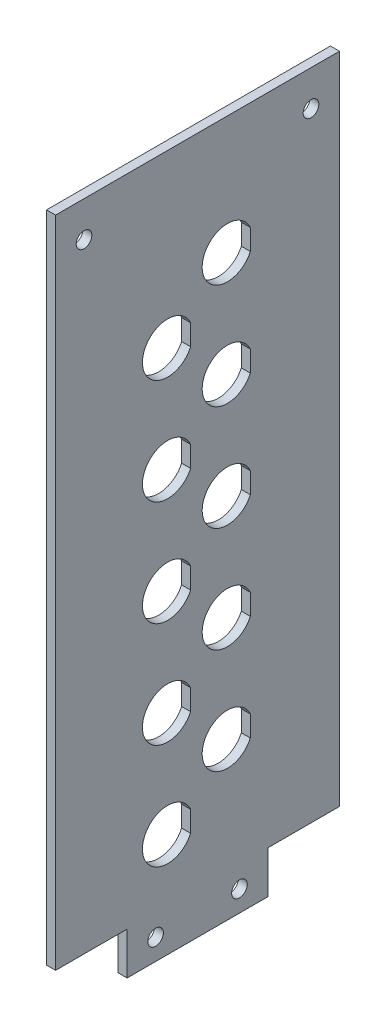
ISO-10303-21;
HEADER;
FILE_DESCRIPTION(('STEP AP214'),'2;1');
FILE_NAME('part.step','',(''),(''),'','','');
FILE_SCHEMA(('AUTOMOTIVE_DESIGN { 1 0 10303 214 1 1 1 1 }'));
ENDSEC;
DATA;
#1=APPLICATION_CONTEXT('core data for automotive mechanical design processes');
#2=APPLICATION_PROTOCOL_DEFINITION('international standard','automotive_design',2000,#1);
#3=PRODUCT_CONTEXT('',#1,'mechanical');
#4=PRODUCT('Part','Part','',(#3));
#5=PRODUCT_RELATED_PRODUCT_CATEGORY('part','',(#4));
#6=PRODUCT_DEFINITION_FORMATION('','',#4);
#7=PRODUCT_DEFINITION_CONTEXT('part definition',#1,'design');
#8=PRODUCT_DEFINITION('design','',#6,#7);
#9=PRODUCT_DEFINITION_SHAPE('','',#8);
#10=(LENGTH_UNIT() NAMED_UNIT(*) SI_UNIT(.MILLI.,.METRE.));
#11=(NAMED_UNIT(*) PLANE_ANGLE_UNIT() SI_UNIT($,.RADIAN.));
#12=(NAMED_UNIT(*) SI_UNIT($,.STERADIAN.) SOLID_ANGLE_UNIT());
#13=UNCERTAINTY_MEASURE_WITH_UNIT(LENGTH_MEASURE(1.E-05),#10,'distance_accuracy_value','');
#14=(GEOMETRIC_REPRESENTATION_CONTEXT(3) GLOBAL_UNCERTAINTY_ASSIGNED_CONTEXT((#13)) GLOBAL_UNIT_ASSIGNED_CONTEXT((#10,
#11,#12)) REPRESENTATION_CONTEXT('',''));
#15=CARTESIAN_POINT('',(0.,0.,0.));
#16=DIRECTION('',(0.,0.,1.));
#17=DIRECTION('',(1.,0.,0.));
#18=AXIS2_PLACEMENT_3D('',#15,#16,#17);
#19=CARTESIAN_POINT('',(3.175,0.,24.75));
#20=DIRECTION('',(0.,0.,-1.));
#21=DIRECTION('',(0.,1.,0.));
#22=AXIS2_PLACEMENT_3D('',#19,#20,#21);
#23=PLANE('',#22);
#24=DIRECTION('',(0.,-1.,0.));
#25=VECTOR('',#24,1.);
#26=CARTESIAN_POINT('',(0.,0.,24.75));
#27=LINE('',#26,#25);
#28=CARTESIAN_POINT('',(0.,-115.,24.75));
#29=VERTEX_POINT('',#28);
#30=CARTESIAN_POINT('',(0.,-129.9,24.75));
#31=VERTEX_POINT('',#30);
#32=EDGE_CURVE('E508',#29,#31,#27,.T.);
#33=ORIENTED_EDGE('',*,*,#32,.T.);
#34=DIRECTION('',(-1.,0.,0.));
#35=VECTOR('',#34,1.);
#36=CARTESIAN_POINT('',(3.175,-129.9,24.75));
#37=LINE('',#36,#35);
#38=CARTESIAN_POINT('',(3.175,-129.9,24.75));
#39=VERTEX_POINT('',#38);
#40=EDGE_CURVE('E11',#39,#31,#37,.T.);
#41=ORIENTED_EDGE('',*,*,#40,.F.);
#42=DIRECTION('',(0.,-1.,0.));
#43=VECTOR('',#42,1.);
#44=CARTESIAN_POINT('',(3.175,0.,24.75));
#45=LINE('',#44,#43);
#46=CARTESIAN_POINT('',(3.175,-115.,24.75));
#47=VERTEX_POINT('',#46);
#48=EDGE_CURVE('E466',#47,#39,#45,.T.);
#49=ORIENTED_EDGE('',*,*,#48,.F.);
#50=DIRECTION('',(-1.,0.,0.));
#51=VECTOR('',#50,1.);
#52=CARTESIAN_POINT('',(3.175,-115.,24.75));
#53=LINE('',#52,#51);
#54=EDGE_CURVE('E500',#47,#29,#53,.T.);
#55=ORIENTED_EDGE('',*,*,#54,.T.);
#56=EDGE_LOOP('',(#33,#41,#49,#55));
#57=FACE_BOUND('',#56,.T.);
#58=ADVANCED_FACE('F47',(#57),#23,.F.);
#59=CARTESIAN_POINT('',(3.175,-129.9,0.));
#60=DIRECTION('',(0.,1.,0.));
#61=DIRECTION('',(0.,0.,1.));
#62=AXIS2_PLACEMENT_3D('',#59,#60,#61);
#63=PLANE('',#62);
#64=DIRECTION('',(0.,0.,-1.));
#65=VECTOR('',#64,1.);
#66=CARTESIAN_POINT('',(0.,-129.9,0.));
#67=LINE('',#66,#65);
#68=CARTESIAN_POINT('',(0.,-129.9,-24.75));
#69=VERTEX_POINT('',#68);
#70=EDGE_CURVE('E512',#31,#69,#67,.T.);
#71=ORIENTED_EDGE('',*,*,#70,.T.);
#72=DIRECTION('',(-1.,0.,0.));
#73=VECTOR('',#72,1.);
#74=CARTESIAN_POINT('',(3.175,-129.9,-24.75));
#75=LINE('',#74,#73);
#76=CARTESIAN_POINT('',(3.175,-129.9,-24.75));
#77=VERTEX_POINT('',#76);
#78=EDGE_CURVE('E56',#77,#69,#75,.T.);
#79=ORIENTED_EDGE('',*,*,#78,.F.);
#80=DIRECTION('',(0.,0.,-1.));
#81=VECTOR('',#80,1.);
#82=CARTESIAN_POINT('',(3.175,-129.9,0.));
#83=LINE('',#82,#81);
#84=EDGE_CURVE('E470',#39,#77,#83,.T.);
#85=ORIENTED_EDGE('',*,*,#84,.F.);
#86=ORIENTED_EDGE('',*,*,#40,.T.);
#87=EDGE_LOOP('',(#71,#79,#85,#86));
#88=FACE_BOUND('',#87,.T.);
#89=ADVANCED_FACE('F567',(#88),#63,.F.);
#90=CARTESIAN_POINT('',(3.175,0.,-24.75));
#91=DIRECTION('',(0.,0.,-1.));
#92=DIRECTION('',(0.,1.,0.));
#93=AXIS2_PLACEMENT_3D('',#90,#91,#92);
#94=PLANE('',#93);
#95=DIRECTION('',(0.,-1.,0.));
#96=VECTOR('',#95,1.);
#97=CARTESIAN_POINT('',(0.,0.,-24.75));
#98=LINE('',#97,#96);
#99=CARTESIAN_POINT('',(0.,-115.,-24.75));
#100=VERTEX_POINT('',#99);
#101=EDGE_CURVE('E516',#100,#69,#98,.T.);
#102=ORIENTED_EDGE('',*,*,#101,.F.);
#103=DIRECTION('',(-1.,0.,0.));
#104=VECTOR('',#103,1.);
#105=CARTESIAN_POINT('',(3.175,-115.,-24.75));
#106=LINE('',#105,#104);
#107=CARTESIAN_POINT('',(3.175,-115.,-24.75));
#108=VERTEX_POINT('',#107);
#109=EDGE_CURVE('E558',#108,#100,#106,.T.);
#110=ORIENTED_EDGE('',*,*,#109,.F.);
#111=DIRECTION('',(0.,-1.,0.));
#112=VECTOR('',#111,1.);
#113=CARTESIAN_POINT('',(3.175,0.,-24.75));
#114=LINE('',#113,#112);
#115=EDGE_CURVE('E473',#108,#77,#114,.T.);
#116=ORIENTED_EDGE('',*,*,#115,.T.);
#117=ORIENTED_EDGE('',*,*,#78,.T.);
#118=EDGE_LOOP('',(#102,#110,#116,#117));
#119=FACE_BOUND('',#118,.T.);
#120=ADVANCED_FACE('F564',(#119),#94,.T.);
#121=CARTESIAN_POINT('',(3.175,-115.,0.));
#122=DIRECTION('',(0.,-1.,0.));
#123=DIRECTION('',(0.,0.,-1.));
#124=AXIS2_PLACEMENT_3D('',#121,#122,#123);
#125=PLANE('',#124);
#126=DIRECTION('',(0.,0.,1.));
#127=VECTOR('',#126,1.);
#128=CARTESIAN_POINT('',(0.,-115.,0.));
#129=LINE('',#128,#127);
#130=CARTESIAN_POINT('',(0.,-115.,-49.9));
#131=VERTEX_POINT('',#130);
#132=EDGE_CURVE('E520',#131,#100,#129,.T.);
#133=ORIENTED_EDGE('',*,*,#132,.F.);
#134=DIRECTION('',(-1.,0.,0.));
#135=VECTOR('',#134,1.);
#136=CARTESIAN_POINT('',(3.175,-115.,-49.9));
#137=LINE('',#136,#135);
#138=CARTESIAN_POINT('',(3.175,-115.,-49.9));
#139=VERTEX_POINT('',#138);
#140=EDGE_CURVE('E555',#139,#131,#137,.T.);
#141=ORIENTED_EDGE('',*,*,#140,.F.);
#142=DIRECTION('',(0.,0.,1.));
#143=VECTOR('',#142,1.);
#144=CARTESIAN_POINT('',(3.175,-115.,0.));
#145=LINE('',#144,#143);
#146=EDGE_CURVE('E477',#139,#108,#145,.T.);
#147=ORIENTED_EDGE('',*,*,#146,.T.);
#148=ORIENTED_EDGE('',*,*,#109,.T.);
#149=EDGE_LOOP('',(#133,#141,#147,#148));
#150=FACE_BOUND('',#149,.T.);
#151=ADVANCED_FACE('F577',(#150),#125,.T.);
#152=CARTESIAN_POINT('',(3.175,0.,-49.9));
#153=DIRECTION('',(0.,0.,1.));
#154=DIRECTION('',(1.,0.,0.));
#155=AXIS2_PLACEMENT_3D('',#152,#153,#154);
#156=PLANE('',#155);
#157=DIRECTION('',(0.,1.,0.));
#158=VECTOR('',#157,1.);
#159=CARTESIAN_POINT('',(0.,0.,-49.9));
#160=LINE('',#159,#158);
#161=CARTESIAN_POINT('',(0.,115.,-49.9));
#162=VERTEX_POINT('',#161);
#163=EDGE_CURVE('E524',#131,#162,#160,.T.);
#164=ORIENTED_EDGE('',*,*,#163,.T.);
#165=DIRECTION('',(-1.,0.,0.));
#166=VECTOR('',#165,1.);
#167=CARTESIAN_POINT('',(3.175,115.,-49.9));
#168=LINE('',#167,#166);
#169=CARTESIAN_POINT('',(3.175,115.,-49.9));
#170=VERTEX_POINT('',#169);
#171=EDGE_CURVE('E551',#170,#162,#168,.T.);
#172=ORIENTED_EDGE('',*,*,#171,.F.);
#173=DIRECTION('',(0.,1.,0.));
#174=VECTOR('',#173,1.);
#175=CARTESIAN_POINT('',(3.175,0.,-49.9));
#176=LINE('',#175,#174);
#177=EDGE_CURVE('E481',#139,#170,#176,.T.);
#178=ORIENTED_EDGE('',*,*,#177,.F.);
#179=ORIENTED_EDGE('',*,*,#140,.T.);
#180=EDGE_LOOP('',(#164,#172,#178,#179));
#181=FACE_BOUND('',#180,.T.);
#182=ADVANCED_FACE('F602',(#181),#156,.F.);
#183=CARTESIAN_POINT('',(3.175,115.,0.));
#184=DIRECTION('',(0.,-1.,0.));
#185=DIRECTION('',(0.,0.,-1.));
#186=AXIS2_PLACEMENT_3D('',#183,#184,#185);
#187=PLANE('',#186);
#188=DIRECTION('',(0.,0.,1.));
#189=VECTOR('',#188,1.);
#190=CARTESIAN_POINT('',(0.,115.,0.));
#191=LINE('',#190,#189);
#192=CARTESIAN_POINT('',(0.,115.,49.9));
#193=VERTEX_POINT('',#192);
#194=EDGE_CURVE('E528',#162,#193,#191,.T.);
#195=ORIENTED_EDGE('',*,*,#194,.T.);
#196=DIRECTION('',(-1.,0.,0.));
#197=VECTOR('',#196,1.);
#198=CARTESIAN_POINT('',(3.175,115.,49.9));
#199=LINE('',#198,#197);
#200=CARTESIAN_POINT('',(3.175,115.,49.9));
#201=VERTEX_POINT('',#200);
#202=EDGE_CURVE('E548',#201,#193,#199,.T.);
#203=ORIENTED_EDGE('',*,*,#202,.F.);
#204=DIRECTION('',(0.,0.,1.));
#205=VECTOR('',#204,1.);
#206=CARTESIAN_POINT('',(3.175,115.,0.));
#207=LINE('',#206,#205);
#208=EDGE_CURVE('E485',#170,#201,#207,.T.);
#209=ORIENTED_EDGE('',*,*,#208,.F.);
#210=ORIENTED_EDGE('',*,*,#171,.T.);
#211=EDGE_LOOP('',(#195,#203,#209,#210));
#212=FACE_BOUND('',#211,.T.);
#213=ADVANCED_FACE('F598',(#212),#187,.F.);
#214=CARTESIAN_POINT('',(3.175,0.,49.9));
#215=DIRECTION('',(0.,0.,1.));
#216=DIRECTION('',(1.,0.,0.));
#217=AXIS2_PLACEMENT_3D('',#214,#215,#216);
#218=PLANE('',#217);
#219=DIRECTION('',(0.,1.,0.));
#220=VECTOR('',#219,1.);
#221=CARTESIAN_POINT('',(0.,0.,49.9));
#222=LINE('',#221,#220);
#223=CARTESIAN_POINT('',(0.,-115.,49.9));
#224=VERTEX_POINT('',#223);
#225=EDGE_CURVE('E532',#224,#193,#222,.T.);
#226=ORIENTED_EDGE('',*,*,#225,.F.);
#227=DIRECTION('',(-1.,0.,0.));
#228=VECTOR('',#227,1.);
#229=CARTESIAN_POINT('',(3.175,-115.,49.9));
#230=LINE('',#229,#228);
#231=CARTESIAN_POINT('',(3.175,-115.,49.9));
#232=VERTEX_POINT('',#231);
#233=EDGE_CURVE('E545',#232,#224,#230,.T.);
#234=ORIENTED_EDGE('',*,*,#233,.F.);
#235=DIRECTION('',(0.,1.,0.));
#236=VECTOR('',#235,1.);
#237=CARTESIAN_POINT('',(3.175,0.,49.9));
#238=LINE('',#237,#236);
#239=EDGE_CURVE('E488',#232,#201,#238,.T.);
#240=ORIENTED_EDGE('',*,*,#239,.T.);
#241=ORIENTED_EDGE('',*,*,#202,.T.);
#242=EDGE_LOOP('',(#226,#234,#240,#241));
#243=FACE_BOUND('',#242,.T.);
#244=ADVANCED_FACE('F595',(#243),#218,.T.);
#245=CARTESIAN_POINT('',(3.175,102.5,-39.9));
#246=DIRECTION('',(-1.,0.,0.));
#247=DIRECTION('',(0.,0.,1.));
#248=AXIS2_PLACEMENT_3D('',#245,#246,#247);
#249=CYLINDRICAL_SURFACE('',#248,2.75000000000001);
#250=CARTESIAN_POINT('',(3.175,102.5,-39.9));
#251=DIRECTION('',(1.,0.,0.));
#252=DIRECTION('',(0.,0.,-1.));
#253=AXIS2_PLACEMENT_3D('',#250,#251,#252);
#254=CIRCLE('',#253,2.75000000000001);
#255=CARTESIAN_POINT('',(3.175,102.5,-42.65));
#256=VERTEX_POINT('',#255);
#257=EDGE_CURVE('E492',#256,#256,#254,.T.);
#258=ORIENTED_EDGE('',*,*,#257,.T.);
#259=EDGE_LOOP('',(#258));
#260=FACE_BOUND('',#259,.T.);
#261=CARTESIAN_POINT('',(0.,102.5,-39.9));
#262=DIRECTION('',(1.,0.,0.));
#263=DIRECTION('',(0.,0.,-1.));
#264=AXIS2_PLACEMENT_3D('',#261,#262,#263);
#265=CIRCLE('',#264,2.75000000000001);
#266=CARTESIAN_POINT('',(0.,102.5,-42.65));
#267=VERTEX_POINT('',#266);
#268=EDGE_CURVE('E536',#267,#267,#265,.T.);
#269=ORIENTED_EDGE('',*,*,#268,.F.);
#270=EDGE_LOOP('',(#269));
#271=FACE_BOUND('',#270,.T.);
#272=ADVANCED_FACE('F627',(#260,#271),#249,.F.);
#273=EDGE_CURVE('E525',#29,#224,#129,.T.);
#274=ORIENTED_EDGE('',*,*,#273,.F.);
#275=ORIENTED_EDGE('',*,*,#54,.F.);
#276=EDGE_CURVE('E482',#47,#232,#145,.T.);
#277=ORIENTED_EDGE('',*,*,#276,.T.);
#278=ORIENTED_EDGE('',*,*,#233,.T.);
#279=EDGE_LOOP('',(#274,#275,#277,#278));
#280=FACE_BOUND('',#279,.T.);
#281=ADVANCED_FACE('F590',(#280),#125,.T.);
#282=CARTESIAN_POINT('',(3.175,-122.5,14.75));
#283=DIRECTION('',(-1.,0.,0.));
#284=DIRECTION('',(0.,0.,1.));
#285=AXIS2_PLACEMENT_3D('',#282,#283,#284);
#286=CYLINDRICAL_SURFACE('',#285,2.75000000000001);
#287=CARTESIAN_POINT('',(3.175,-122.5,14.75));
#288=DIRECTION('',(1.,0.,0.));
#289=DIRECTION('',(0.,0.,-1.));
#290=AXIS2_PLACEMENT_3D('',#287,#288,#289);
#291=CIRCLE('',#290,2.75000000000001);
#292=CARTESIAN_POINT('',(3.175,-122.5,12.));
#293=VERTEX_POINT('',#292);
#294=EDGE_CURVE('E461',#293,#293,#291,.T.);
#295=ORIENTED_EDGE('',*,*,#294,.T.);
#296=EDGE_LOOP('',(#295));
#297=FACE_BOUND('',#296,.T.);
#298=CARTESIAN_POINT('',(0.,-122.5,14.75));
#299=DIRECTION('',(1.,0.,0.));
#300=DIRECTION('',(0.,0.,-1.));
#301=AXIS2_PLACEMENT_3D('',#298,#299,#300);
#302=CIRCLE('',#301,2.75000000000001);
#303=CARTESIAN_POINT('',(0.,-122.5,12.));
#304=VERTEX_POINT('',#303);
#305=EDGE_CURVE('E504',#304,#304,#302,.T.);
#306=ORIENTED_EDGE('',*,*,#305,.F.);
#307=EDGE_LOOP('',(#306));
#308=FACE_BOUND('',#307,.T.);
#309=ADVANCED_FACE('F618',(#297,#308),#286,.F.);
#310=CARTESIAN_POINT('',(3.175,-122.5,-14.75));
#311=DIRECTION('',(-1.,0.,0.));
#312=DIRECTION('',(0.,0.,1.));
#313=AXIS2_PLACEMENT_3D('',#310,#311,#312);
#314=CYLINDRICAL_SURFACE('',#313,2.75000000000001);
#315=CARTESIAN_POINT('',(3.175,-122.5,-14.75));
#316=DIRECTION('',(1.,0.,0.));
#317=DIRECTION('',(0.,0.,-1.));
#318=AXIS2_PLACEMENT_3D('',#315,#316,#317);
#319=CIRCLE('',#318,2.75000000000001);
#320=CARTESIAN_POINT('',(3.175,-122.5,-17.5));
#321=VERTEX_POINT('',#320);
#322=EDGE_CURVE('E457',#321,#321,#319,.T.);
#323=ORIENTED_EDGE('',*,*,#322,.T.);
#324=EDGE_LOOP('',(#323));
#325=FACE_BOUND('',#324,.T.);
#326=CARTESIAN_POINT('',(0.,-122.5,-14.75));
#327=DIRECTION('',(1.,0.,0.));
#328=DIRECTION('',(0.,0.,-1.));
#329=AXIS2_PLACEMENT_3D('',#326,#327,#328);
#330=CIRCLE('',#329,2.75000000000001);
#331=CARTESIAN_POINT('',(0.,-122.5,-17.5));
#332=VERTEX_POINT('',#331);
#333=EDGE_CURVE('E453',#332,#332,#330,.T.);
#334=ORIENTED_EDGE('',*,*,#333,.F.);
#335=EDGE_LOOP('',(#334));
#336=FACE_BOUND('',#335,.T.);
#337=ADVANCED_FACE('F49',(#325,#336),#314,.F.);
#338=CARTESIAN_POINT('',(3.175,102.5,39.9));
#339=DIRECTION('',(-1.,0.,0.));
#340=DIRECTION('',(0.,0.,1.));
#341=AXIS2_PLACEMENT_3D('',#338,#339,#340);
#342=CYLINDRICAL_SURFACE('',#341,2.74999999999999);
#343=CARTESIAN_POINT('',(3.175,102.5,39.9));
#344=DIRECTION('',(1.,0.,0.));
#345=DIRECTION('',(0.,0.,-1.));
#346=AXIS2_PLACEMENT_3D('',#343,#344,#345);
#347=CIRCLE('',#346,2.74999999999999);
#348=CARTESIAN_POINT('',(3.175,102.5,37.15));
#349=VERTEX_POINT('',#348);
#350=EDGE_CURVE('E496',#349,#349,#347,.T.);
#351=ORIENTED_EDGE('',*,*,#350,.T.);
#352=EDGE_LOOP('',(#351));
#353=FACE_BOUND('',#352,.T.);
#354=CARTESIAN_POINT('',(0.,102.5,39.9));
#355=DIRECTION('',(1.,0.,0.));
#356=DIRECTION('',(0.,0.,-1.));
#357=AXIS2_PLACEMENT_3D('',#354,#355,#356);
#358=CIRCLE('',#357,2.74999999999999);
#359=CARTESIAN_POINT('',(0.,102.5,37.15));
#360=VERTEX_POINT('',#359);
#361=EDGE_CURVE('E462',#360,#360,#358,.T.);
#362=ORIENTED_EDGE('',*,*,#361,.F.);
#363=EDGE_LOOP('',(#362));
#364=FACE_BOUND('',#363,.T.);
#365=ADVANCED_FACE('F625',(#353,#364),#342,.F.);
#366=CARTESIAN_POINT('',(3.175,0.,0.));
#367=DIRECTION('',(1.,0.,0.));
#368=DIRECTION('',(0.,0.,-1.));
#369=AXIS2_PLACEMENT_3D('',#366,#367,#368);
#370=PLANE('',#369);
#371=CARTESIAN_POINT('',(3.175,-0.739870411274178,-10.5));
#372=DIRECTION('',(1.,0.,0.));
#373=DIRECTION('',(0.,0.,1.));
#374=AXIS2_PLACEMENT_3D('',#371,#372,#373);
#375=CIRCLE('',#374,8.86459999999999);
#376=CARTESIAN_POINT('',(3.175,2.91252240987744,-18.5772));
#377=VERTEX_POINT('',#376);
#378=CARTESIAN_POINT('',(3.175,-4.39226323242581,-18.5772));
#379=VERTEX_POINT('',#378);
#380=EDGE_CURVE('E63',#377,#379,#375,.T.);
#381=ORIENTED_EDGE('',*,*,#380,.F.);
#382=DIRECTION('',(0.,1.,0.));
#383=VECTOR('',#382,1.);
#384=CARTESIAN_POINT('',(3.175,-4.39226323242581,-18.5772));
#385=LINE('',#384,#383);
#386=EDGE_CURVE('E314',#379,#377,#385,.T.);
#387=ORIENTED_EDGE('',*,*,#386,.F.);
#388=EDGE_LOOP('',(#381,#387));
#389=FACE_BOUND('',#388,.T.);
#390=CARTESIAN_POINT('',(3.175,-56.3006479436307,10.4999999999996));
#391=DIRECTION('',(1.,0.,0.));
#392=DIRECTION('',(0.,0.,1.));
#393=AXIS2_PLACEMENT_3D('',#390,#391,#392);
#394=CIRCLE('',#393,8.8646);
#395=CARTESIAN_POINT('',(3.175,-52.6482551224791,2.4227999999996));
#396=VERTEX_POINT('',#395);
#397=CARTESIAN_POINT('',(3.175,-59.9530407647824,2.4227999999996));
#398=VERTEX_POINT('',#397);
#399=EDGE_CURVE('E71',#396,#398,#394,.T.);
#400=ORIENTED_EDGE('',*,*,#399,.F.);
#401=DIRECTION('',(0.,1.,0.));
#402=VECTOR('',#401,1.);
#403=CARTESIAN_POINT('',(3.175,-59.9530407647824,2.4227999999996));
#404=LINE('',#403,#402);
#405=EDGE_CURVE('E334',#398,#396,#404,.T.);
#406=ORIENTED_EDGE('',*,*,#405,.F.);
#407=EDGE_LOOP('',(#400,#406));
#408=FACE_BOUND('',#407,.T.);
#409=CARTESIAN_POINT('',(3.175,-37.7803887661785,-10.5000000000003));
#410=DIRECTION('',(1.,0.,0.));
#411=DIRECTION('',(0.,0.,1.));
#412=AXIS2_PLACEMENT_3D('',#409,#410,#411);
#413=CIRCLE('',#412,8.8646);
#414=CARTESIAN_POINT('',(3.175,-34.1279959450268,-18.5772000000003));
#415=VERTEX_POINT('',#414);
#416=CARTESIAN_POINT('',(3.175,-41.4327815873301,-18.5772000000003));
#417=VERTEX_POINT('',#416);
#418=EDGE_CURVE('E279',#415,#417,#413,.T.);
#419=ORIENTED_EDGE('',*,*,#418,.F.);
#420=DIRECTION('',(0.,1.,0.));
#421=VECTOR('',#420,1.);
#422=CARTESIAN_POINT('',(3.175,-41.4327815873301,-18.5772000000003));
#423=LINE('',#422,#421);
#424=EDGE_CURVE('E275',#417,#415,#423,.T.);
#425=ORIENTED_EDGE('',*,*,#424,.F.);
#426=EDGE_LOOP('',(#419,#425));
#427=FACE_BOUND('',#426,.T.);
#428=CARTESIAN_POINT('',(3.175,-93.341166298535,10.4999999999993));
#429=DIRECTION('',(1.,0.,0.));
#430=DIRECTION('',(0.,0.,1.));
#431=AXIS2_PLACEMENT_3D('',#428,#429,#430);
#432=CIRCLE('',#431,8.8646);
#433=CARTESIAN_POINT('',(3.175,-89.6887734773834,2.42279999999934));
#434=VERTEX_POINT('',#433);
#435=CARTESIAN_POINT('',(3.175,-96.9935591196866,2.42279999999934));
#436=VERTEX_POINT('',#435);
#437=EDGE_CURVE('E274',#434,#436,#432,.T.);
#438=ORIENTED_EDGE('',*,*,#437,.F.);
#439=DIRECTION('',(0.,1.,0.));
#440=VECTOR('',#439,1.);
#441=CARTESIAN_POINT('',(3.175,-96.9935591196866,2.42279999999934));
#442=LINE('',#441,#440);
#443=EDGE_CURVE('E294',#436,#434,#442,.T.);
#444=ORIENTED_EDGE('',*,*,#443,.F.);
#445=EDGE_LOOP('',(#438,#444));
#446=FACE_BOUND('',#445,.T.);
#447=CARTESIAN_POINT('',(3.175,73.3411662985343,-10.4999999999995));
#448=DIRECTION('',(1.,0.,0.));
#449=DIRECTION('',(0.,0.,1.));
#450=AXIS2_PLACEMENT_3D('',#447,#448,#449);
#451=CIRCLE('',#450,8.8646);
#452=CARTESIAN_POINT('',(3.175,76.993559119686,-18.5771999999995));
#453=VERTEX_POINT('',#452);
#454=CARTESIAN_POINT('',(3.175,69.6887734773827,-18.5771999999995));
#455=VERTEX_POINT('',#454);
#456=EDGE_CURVE('E404',#453,#455,#451,.T.);
#457=ORIENTED_EDGE('',*,*,#456,.F.);
#458=DIRECTION('',(0.,1.,0.));
#459=VECTOR('',#458,1.);
#460=CARTESIAN_POINT('',(3.175,69.6887734773827,-18.5771999999995));
#461=LINE('',#460,#459);
#462=EDGE_CURVE('E400',#455,#453,#461,.T.);
#463=ORIENTED_EDGE('',*,*,#462,.F.);
#464=EDGE_LOOP('',(#457,#463));
#465=FACE_BOUND('',#464,.T.);
#466=CARTESIAN_POINT('',(3.175,17.7803887661778,10.5000000000001));
#467=DIRECTION('',(1.,0.,0.));
#468=DIRECTION('',(0.,0.,1.));
#469=AXIS2_PLACEMENT_3D('',#466,#467,#468);
#470=CIRCLE('',#469,8.8646);
#471=CARTESIAN_POINT('',(3.175,21.4327815873294,2.42280000000011));
#472=VERTEX_POINT('',#471);
#473=CARTESIAN_POINT('',(3.175,14.1279959450262,2.42280000000011));
#474=VERTEX_POINT('',#473);
#475=EDGE_CURVE('E399',#472,#474,#470,.T.);
#476=ORIENTED_EDGE('',*,*,#475,.F.);
#477=DIRECTION('',(0.,1.,0.));
#478=VECTOR('',#477,1.);
#479=CARTESIAN_POINT('',(3.175,14.1279959450262,2.42280000000011));
#480=LINE('',#479,#478);
#481=EDGE_CURVE('E422',#474,#472,#480,.T.);
#482=ORIENTED_EDGE('',*,*,#481,.F.);
#483=EDGE_LOOP('',(#476,#482));
#484=FACE_BOUND('',#483,.T.);
#485=CARTESIAN_POINT('',(3.175,36.3006479436301,-10.4999999999998));
#486=DIRECTION('',(1.,0.,0.));
#487=DIRECTION('',(0.,0.,1.));
#488=AXIS2_PLACEMENT_3D('',#485,#486,#487);
#489=CIRCLE('',#488,8.8646);
#490=CARTESIAN_POINT('',(3.175,39.9530407647817,-18.5771999999998));
#491=VERTEX_POINT('',#490);
#492=CARTESIAN_POINT('',(3.175,32.6482551224785,-18.5771999999998));
#493=VERTEX_POINT('',#492);
#494=EDGE_CURVE('E360',#491,#493,#489,.T.);
#495=ORIENTED_EDGE('',*,*,#494,.F.);
#496=DIRECTION('',(0.,1.,0.));
#497=VECTOR('',#496,1.);
#498=CARTESIAN_POINT('',(3.175,32.6482551224785,-18.5771999999998));
#499=LINE('',#498,#497);
#500=EDGE_CURVE('E356',#493,#491,#499,.T.);
#501=ORIENTED_EDGE('',*,*,#500,.F.);
#502=EDGE_LOOP('',(#495,#501));
#503=FACE_BOUND('',#502,.T.);
#504=CARTESIAN_POINT('',(3.175,-19.2601295887265,10.4999999999999));
#505=DIRECTION('',(1.,0.,0.));
#506=DIRECTION('',(0.,0.,1.));
#507=AXIS2_PLACEMENT_3D('',#504,#505,#506);
#508=CIRCLE('',#507,8.8646);
#509=CARTESIAN_POINT('',(3.175,-15.6077367675748,2.42279999999985));
#510=VERTEX_POINT('',#509);
#511=CARTESIAN_POINT('',(3.175,-22.9125224098781,2.42279999999985));
#512=VERTEX_POINT('',#511);
#513=EDGE_CURVE('E355',#510,#512,#508,.T.);
#514=ORIENTED_EDGE('',*,*,#513,.F.);
#515=DIRECTION('',(0.,1.,0.));
#516=VECTOR('',#515,1.);
#517=CARTESIAN_POINT('',(3.175,-22.9125224098781,2.42279999999985));
#518=LINE('',#517,#516);
#519=EDGE_CURVE('E378',#512,#510,#518,.T.);
#520=ORIENTED_EDGE('',*,*,#519,.F.);
#521=EDGE_LOOP('',(#514,#520));
#522=FACE_BOUND('',#521,.T.);
#523=CARTESIAN_POINT('',(3.175,-74.8209071210827,-10.5000000000005));
#524=DIRECTION('',(1.,0.,0.));
#525=DIRECTION('',(0.,0.,1.));
#526=AXIS2_PLACEMENT_3D('',#523,#524,#525);
#527=CIRCLE('',#526,8.8646);
#528=CARTESIAN_POINT('',(3.175,-71.1685142999311,-18.5772000000005));
#529=VERTEX_POINT('',#528);
#530=CARTESIAN_POINT('',(3.175,-78.4732999422343,-18.5772000000005));
#531=VERTEX_POINT('',#530);
#532=EDGE_CURVE('E236',#529,#531,#527,.T.);
#533=ORIENTED_EDGE('',*,*,#532,.F.);
#534=DIRECTION('',(0.,1.,0.));
#535=VECTOR('',#534,1.);
#536=CARTESIAN_POINT('',(3.175,-78.4732999422343,-18.5772000000005));
#537=LINE('',#536,#535);
#538=EDGE_CURVE('E247',#531,#529,#537,.T.);
#539=ORIENTED_EDGE('',*,*,#538,.F.);
#540=EDGE_LOOP('',(#533,#539));
#541=FACE_BOUND('',#540,.T.);
#542=CARTESIAN_POINT('',(3.175,54.8209071210821,10.5000000000004));
#543=DIRECTION('',(1.,0.,0.));
#544=DIRECTION('',(0.,0.,1.));
#545=AXIS2_PLACEMENT_3D('',#542,#543,#544);
#546=CIRCLE('',#545,8.8646);
#547=CARTESIAN_POINT('',(3.175,58.4732999422337,2.42280000000037));
#548=VERTEX_POINT('',#547);
#549=CARTESIAN_POINT('',(3.175,51.1685142999305,2.42280000000037));
#550=VERTEX_POINT('',#549);
#551=EDGE_CURVE('E408',#548,#550,#546,.T.);
#552=ORIENTED_EDGE('',*,*,#551,.F.);
#553=DIRECTION('',(0.,1.,0.));
#554=VECTOR('',#553,1.);
#555=CARTESIAN_POINT('',(3.175,51.1685142999305,2.42280000000037));
#556=LINE('',#555,#554);
#557=EDGE_CURVE('E440',#550,#548,#556,.T.);
#558=ORIENTED_EDGE('',*,*,#557,.F.);
#559=EDGE_LOOP('',(#552,#558));
#560=FACE_BOUND('',#559,.T.);
#561=ORIENTED_EDGE('',*,*,#322,.F.);
#562=EDGE_LOOP('',(#561));
#563=FACE_BOUND('',#562,.T.);
#564=ORIENTED_EDGE('',*,*,#294,.F.);
#565=EDGE_LOOP('',(#564));
#566=FACE_BOUND('',#565,.T.);
#567=ORIENTED_EDGE('',*,*,#48,.T.);
#568=ORIENTED_EDGE('',*,*,#84,.T.);
#569=ORIENTED_EDGE('',*,*,#115,.F.);
#570=ORIENTED_EDGE('',*,*,#146,.F.);
#571=ORIENTED_EDGE('',*,*,#177,.T.);
#572=ORIENTED_EDGE('',*,*,#208,.T.);
#573=ORIENTED_EDGE('',*,*,#239,.F.);
#574=ORIENTED_EDGE('',*,*,#276,.F.);
#575=EDGE_LOOP('',(#567,#568,#569,#570,#571,#572,#573,#574));
#576=FACE_BOUND('',#575,.T.);
#577=ORIENTED_EDGE('',*,*,#257,.F.);
#578=EDGE_LOOP('',(#577));
#579=FACE_BOUND('',#578,.T.);
#580=ORIENTED_EDGE('',*,*,#350,.F.);
#581=EDGE_LOOP('',(#580));
#582=FACE_BOUND('',#581,.T.);
#583=ADVANCED_FACE('F252',(#389,#408,#427,#446,#465,#484,#503,#522,#541,#560,#563,#566,#576,
#579,#582),#370,.T.);
#584=CARTESIAN_POINT('',(0.,0.,0.));
#585=DIRECTION('',(1.,0.,0.));
#586=DIRECTION('',(0.,0.,-1.));
#587=AXIS2_PLACEMENT_3D('',#584,#585,#586);
#588=PLANE('',#587);
#589=DIRECTION('',(0.,1.,0.));
#590=VECTOR('',#589,1.);
#591=CARTESIAN_POINT('',(0.,-4.39226323242581,-18.5772));
#592=LINE('',#591,#590);
#593=CARTESIAN_POINT('',(0.,-4.39226323242581,-18.5772));
#594=VERTEX_POINT('',#593);
#595=CARTESIAN_POINT('',(0.,2.91252240987744,-18.5772));
#596=VERTEX_POINT('',#595);
#597=EDGE_CURVE('E310',#594,#596,#592,.T.);
#598=ORIENTED_EDGE('',*,*,#597,.T.);
#599=CARTESIAN_POINT('',(0.,-0.739870411274178,-10.5));
#600=DIRECTION('',(1.,0.,0.));
#601=DIRECTION('',(0.,0.,1.));
#602=AXIS2_PLACEMENT_3D('',#599,#600,#601);
#603=CIRCLE('',#602,8.86459999999999);
#604=EDGE_CURVE('E318',#596,#594,#603,.T.);
#605=ORIENTED_EDGE('',*,*,#604,.T.);
#606=EDGE_LOOP('',(#598,#605));
#607=FACE_BOUND('',#606,.T.);
#608=DIRECTION('',(0.,1.,0.));
#609=VECTOR('',#608,1.);
#610=CARTESIAN_POINT('',(0.,-59.9530407647824,2.4227999999996));
#611=LINE('',#610,#609);
#612=CARTESIAN_POINT('',(0.,-59.9530407647824,2.4227999999996));
#613=VERTEX_POINT('',#612);
#614=CARTESIAN_POINT('',(0.,-52.6482551224791,2.4227999999996));
#615=VERTEX_POINT('',#614);
#616=EDGE_CURVE('E331',#613,#615,#611,.T.);
#617=ORIENTED_EDGE('',*,*,#616,.T.);
#618=CARTESIAN_POINT('',(0.,-56.3006479436307,10.4999999999996));
#619=DIRECTION('',(1.,0.,0.));
#620=DIRECTION('',(0.,0.,1.));
#621=AXIS2_PLACEMENT_3D('',#618,#619,#620);
#622=CIRCLE('',#621,8.8646);
#623=EDGE_CURVE('E338',#615,#613,#622,.T.);
#624=ORIENTED_EDGE('',*,*,#623,.T.);
#625=EDGE_LOOP('',(#617,#624));
#626=FACE_BOUND('',#625,.T.);
#627=DIRECTION('',(0.,1.,0.));
#628=VECTOR('',#627,1.);
#629=CARTESIAN_POINT('',(0.,-41.4327815873301,-18.5772000000003));
#630=LINE('',#629,#628);
#631=CARTESIAN_POINT('',(0.,-41.4327815873301,-18.5772000000003));
#632=VERTEX_POINT('',#631);
#633=CARTESIAN_POINT('',(0.,-34.1279959450268,-18.5772000000003));
#634=VERTEX_POINT('',#633);
#635=EDGE_CURVE('E270',#632,#634,#630,.T.);
#636=ORIENTED_EDGE('',*,*,#635,.T.);
#637=CARTESIAN_POINT('',(0.,-37.7803887661785,-10.5000000000003));
#638=DIRECTION('',(1.,0.,0.));
#639=DIRECTION('',(0.,0.,1.));
#640=AXIS2_PLACEMENT_3D('',#637,#638,#639);
#641=CIRCLE('',#640,8.8646);
#642=EDGE_CURVE('E280',#634,#632,#641,.T.);
#643=ORIENTED_EDGE('',*,*,#642,.T.);
#644=EDGE_LOOP('',(#636,#643));
#645=FACE_BOUND('',#644,.T.);
#646=DIRECTION('',(0.,1.,0.));
#647=VECTOR('',#646,1.);
#648=CARTESIAN_POINT('',(0.,-96.9935591196866,2.42279999999934));
#649=LINE('',#648,#647);
#650=CARTESIAN_POINT('',(0.,-96.9935591196866,2.42279999999934));
#651=VERTEX_POINT('',#650);
#652=CARTESIAN_POINT('',(0.,-89.6887734773834,2.42279999999934));
#653=VERTEX_POINT('',#652);
#654=EDGE_CURVE('E292',#651,#653,#649,.T.);
#655=ORIENTED_EDGE('',*,*,#654,.T.);
#656=CARTESIAN_POINT('',(0.,-93.341166298535,10.4999999999993));
#657=DIRECTION('',(1.,0.,0.));
#658=DIRECTION('',(0.,0.,1.));
#659=AXIS2_PLACEMENT_3D('',#656,#657,#658);
#660=CIRCLE('',#659,8.8646);
#661=EDGE_CURVE('E298',#653,#651,#660,.T.);
#662=ORIENTED_EDGE('',*,*,#661,.T.);
#663=EDGE_LOOP('',(#655,#662));
#664=FACE_BOUND('',#663,.T.);
#665=DIRECTION('',(0.,1.,0.));
#666=VECTOR('',#665,1.);
#667=CARTESIAN_POINT('',(0.,69.6887734773827,-18.5771999999995));
#668=LINE('',#667,#666);
#669=CARTESIAN_POINT('',(0.,69.6887734773827,-18.5771999999995));
#670=VERTEX_POINT('',#669);
#671=CARTESIAN_POINT('',(0.,76.993559119686,-18.5771999999995));
#672=VERTEX_POINT('',#671);
#673=EDGE_CURVE('E395',#670,#672,#668,.T.);
#674=ORIENTED_EDGE('',*,*,#673,.T.);
#675=CARTESIAN_POINT('',(0.,73.3411662985343,-10.4999999999995));
#676=DIRECTION('',(1.,0.,0.));
#677=DIRECTION('',(0.,0.,1.));
#678=AXIS2_PLACEMENT_3D('',#675,#676,#677);
#679=CIRCLE('',#678,8.8646);
#680=EDGE_CURVE('E405',#672,#670,#679,.T.);
#681=ORIENTED_EDGE('',*,*,#680,.T.);
#682=EDGE_LOOP('',(#674,#681));
#683=FACE_BOUND('',#682,.T.);
#684=DIRECTION('',(0.,1.,0.));
#685=VECTOR('',#684,1.);
#686=CARTESIAN_POINT('',(0.,14.1279959450262,2.42280000000011));
#687=LINE('',#686,#685);
#688=CARTESIAN_POINT('',(0.,14.1279959450262,2.42280000000011));
#689=VERTEX_POINT('',#688);
#690=CARTESIAN_POINT('',(0.,21.4327815873294,2.42280000000011));
#691=VERTEX_POINT('',#690);
#692=EDGE_CURVE('E419',#689,#691,#687,.T.);
#693=ORIENTED_EDGE('',*,*,#692,.T.);
#694=CARTESIAN_POINT('',(0.,17.7803887661778,10.5000000000001));
#695=DIRECTION('',(1.,0.,0.));
#696=DIRECTION('',(0.,0.,1.));
#697=AXIS2_PLACEMENT_3D('',#694,#695,#696);
#698=CIRCLE('',#697,8.8646);
#699=EDGE_CURVE('E426',#691,#689,#698,.T.);
#700=ORIENTED_EDGE('',*,*,#699,.T.);
#701=EDGE_LOOP('',(#693,#700));
#702=FACE_BOUND('',#701,.T.);
#703=DIRECTION('',(0.,1.,0.));
#704=VECTOR('',#703,1.);
#705=CARTESIAN_POINT('',(0.,32.6482551224785,-18.5771999999998));
#706=LINE('',#705,#704);
#707=CARTESIAN_POINT('',(0.,32.6482551224785,-18.5771999999998));
#708=VERTEX_POINT('',#707);
#709=CARTESIAN_POINT('',(0.,39.9530407647817,-18.5771999999998));
#710=VERTEX_POINT('',#709);
#711=EDGE_CURVE('E351',#708,#710,#706,.T.);
#712=ORIENTED_EDGE('',*,*,#711,.T.);
#713=CARTESIAN_POINT('',(0.,36.3006479436301,-10.4999999999998));
#714=DIRECTION('',(1.,0.,0.));
#715=DIRECTION('',(0.,0.,1.));
#716=AXIS2_PLACEMENT_3D('',#713,#714,#715);
#717=CIRCLE('',#716,8.8646);
#718=EDGE_CURVE('E361',#710,#708,#717,.T.);
#719=ORIENTED_EDGE('',*,*,#718,.T.);
#720=EDGE_LOOP('',(#712,#719));
#721=FACE_BOUND('',#720,.T.);
#722=DIRECTION('',(0.,1.,0.));
#723=VECTOR('',#722,1.);
#724=CARTESIAN_POINT('',(0.,-22.9125224098781,2.42279999999985));
#725=LINE('',#724,#723);
#726=CARTESIAN_POINT('',(0.,-22.9125224098781,2.42279999999985));
#727=VERTEX_POINT('',#726);
#728=CARTESIAN_POINT('',(0.,-15.6077367675748,2.42279999999985));
#729=VERTEX_POINT('',#728);
#730=EDGE_CURVE('E375',#727,#729,#725,.T.);
#731=ORIENTED_EDGE('',*,*,#730,.T.);
#732=CARTESIAN_POINT('',(0.,-19.2601295887265,10.4999999999999));
#733=DIRECTION('',(1.,0.,0.));
#734=DIRECTION('',(0.,0.,1.));
#735=AXIS2_PLACEMENT_3D('',#732,#733,#734);
#736=CIRCLE('',#735,8.8646);
#737=EDGE_CURVE('E382',#729,#727,#736,.T.);
#738=ORIENTED_EDGE('',*,*,#737,.T.);
#739=EDGE_LOOP('',(#731,#738));
#740=FACE_BOUND('',#739,.T.);
#741=DIRECTION('',(0.,1.,0.));
#742=VECTOR('',#741,1.);
#743=CARTESIAN_POINT('',(0.,-78.4732999422343,-18.5772000000005));
#744=LINE('',#743,#742);
#745=CARTESIAN_POINT('',(0.,-78.4732999422343,-18.5772000000005));
#746=VERTEX_POINT('',#745);
#747=CARTESIAN_POINT('',(0.,-71.1685142999311,-18.5772000000005));
#748=VERTEX_POINT('',#747);
#749=EDGE_CURVE('E261',#746,#748,#744,.T.);
#750=ORIENTED_EDGE('',*,*,#749,.T.);
#751=CARTESIAN_POINT('',(0.,-74.8209071210827,-10.5000000000005));
#752=DIRECTION('',(1.,0.,0.));
#753=DIRECTION('',(0.,0.,1.));
#754=AXIS2_PLACEMENT_3D('',#751,#752,#753);
#755=CIRCLE('',#754,8.8646);
#756=EDGE_CURVE('E239',#748,#746,#755,.T.);
#757=ORIENTED_EDGE('',*,*,#756,.T.);
#758=EDGE_LOOP('',(#750,#757));
#759=FACE_BOUND('',#758,.T.);
#760=DIRECTION('',(0.,1.,0.));
#761=VECTOR('',#760,1.);
#762=CARTESIAN_POINT('',(0.,51.1685142999305,2.42280000000037));
#763=LINE('',#762,#761);
#764=CARTESIAN_POINT('',(0.,51.1685142999305,2.42280000000037));
#765=VERTEX_POINT('',#764);
#766=CARTESIAN_POINT('',(0.,58.4732999422337,2.42280000000037));
#767=VERTEX_POINT('',#766);
#768=EDGE_CURVE('E439',#765,#767,#763,.T.);
#769=ORIENTED_EDGE('',*,*,#768,.T.);
#770=CARTESIAN_POINT('',(0.,54.8209071210821,10.5000000000004));
#771=DIRECTION('',(1.,0.,0.));
#772=DIRECTION('',(0.,0.,1.));
#773=AXIS2_PLACEMENT_3D('',#770,#771,#772);
#774=CIRCLE('',#773,8.8646);
#775=EDGE_CURVE('E435',#767,#765,#774,.T.);
#776=ORIENTED_EDGE('',*,*,#775,.T.);
#777=EDGE_LOOP('',(#769,#776));
#778=FACE_BOUND('',#777,.T.);
#779=ORIENTED_EDGE('',*,*,#333,.T.);
#780=EDGE_LOOP('',(#779));
#781=FACE_BOUND('',#780,.T.);
#782=ORIENTED_EDGE('',*,*,#305,.T.);
#783=EDGE_LOOP('',(#782));
#784=FACE_BOUND('',#783,.T.);
#785=ORIENTED_EDGE('',*,*,#32,.F.);
#786=ORIENTED_EDGE('',*,*,#273,.T.);
#787=ORIENTED_EDGE('',*,*,#225,.T.);
#788=ORIENTED_EDGE('',*,*,#194,.F.);
#789=ORIENTED_EDGE('',*,*,#163,.F.);
#790=ORIENTED_EDGE('',*,*,#132,.T.);
#791=ORIENTED_EDGE('',*,*,#101,.T.);
#792=ORIENTED_EDGE('',*,*,#70,.F.);
#793=EDGE_LOOP('',(#785,#786,#787,#788,#789,#790,#791,#792));
#794=FACE_BOUND('',#793,.T.);
#795=ORIENTED_EDGE('',*,*,#268,.T.);
#796=EDGE_LOOP('',(#795));
#797=FACE_BOUND('',#796,.T.);
#798=ORIENTED_EDGE('',*,*,#361,.T.);
#799=EDGE_LOOP('',(#798));
#800=FACE_BOUND('',#799,.T.);
#801=ADVANCED_FACE('F571',(#607,#626,#645,#664,#683,#702,#721,#740,#759,#778,#781,#784,#794,
#797,#800),#588,.F.);
#802=CARTESIAN_POINT('',(0.,54.8209071210821,10.5000000000004));
#803=DIRECTION('',(1.,0.,0.));
#804=DIRECTION('',(0.,0.,-1.));
#805=AXIS2_PLACEMENT_3D('',#802,#803,#804);
#806=CYLINDRICAL_SURFACE('',#805,8.8646);
#807=ORIENTED_EDGE('',*,*,#551,.T.);
#808=DIRECTION('',(1.,0.,0.));
#809=VECTOR('',#808,1.);
#810=CARTESIAN_POINT('',(0.,51.1685142999305,2.42280000000037));
#811=LINE('',#810,#809);
#812=EDGE_CURVE('E444',#765,#550,#811,.T.);
#813=ORIENTED_EDGE('',*,*,#812,.F.);
#814=ORIENTED_EDGE('',*,*,#775,.F.);
#815=DIRECTION('',(1.,0.,0.));
#816=VECTOR('',#815,1.);
#817=CARTESIAN_POINT('',(0.,58.4732999422337,2.42280000000037));
#818=LINE('',#817,#816);
#819=EDGE_CURVE('E450',#767,#548,#818,.T.);
#820=ORIENTED_EDGE('',*,*,#819,.T.);
#821=EDGE_LOOP('',(#807,#813,#814,#820));
#822=FACE_BOUND('',#821,.T.);
#823=ADVANCED_FACE('F633',(#822),#806,.F.);
#824=CARTESIAN_POINT('',(0.,51.1685142999305,2.42280000000037));
#825=DIRECTION('',(0.,0.,-1.));
#826=DIRECTION('',(-1.,0.,0.));
#827=AXIS2_PLACEMENT_3D('',#824,#825,#826);
#828=PLANE('',#827);
#829=ORIENTED_EDGE('',*,*,#557,.T.);
#830=ORIENTED_EDGE('',*,*,#819,.F.);
#831=ORIENTED_EDGE('',*,*,#768,.F.);
#832=ORIENTED_EDGE('',*,*,#812,.T.);
#833=EDGE_LOOP('',(#829,#830,#831,#832));
#834=FACE_BOUND('',#833,.T.);
#835=ADVANCED_FACE('F640',(#834),#828,.F.);
#836=CARTESIAN_POINT('',(0.,-74.8209071210827,-10.5000000000005));
#837=DIRECTION('',(1.,0.,0.));
#838=DIRECTION('',(0.,0.,-1.));
#839=AXIS2_PLACEMENT_3D('',#836,#837,#838);
#840=CYLINDRICAL_SURFACE('',#839,8.8646);
#841=ORIENTED_EDGE('',*,*,#532,.T.);
#842=DIRECTION('',(1.,0.,0.));
#843=VECTOR('',#842,1.);
#844=CARTESIAN_POINT('',(0.,-78.4732999422343,-18.5772000000005));
#845=LINE('',#844,#843);
#846=EDGE_CURVE('E244',#746,#531,#845,.T.);
#847=ORIENTED_EDGE('',*,*,#846,.F.);
#848=ORIENTED_EDGE('',*,*,#756,.F.);
#849=DIRECTION('',(1.,0.,0.));
#850=VECTOR('',#849,1.);
#851=CARTESIAN_POINT('',(0.,-71.1685142999311,-18.5772000000005));
#852=LINE('',#851,#850);
#853=EDGE_CURVE('E232',#748,#529,#852,.T.);
#854=ORIENTED_EDGE('',*,*,#853,.T.);
#855=EDGE_LOOP('',(#841,#847,#848,#854));
#856=FACE_BOUND('',#855,.T.);
#857=ADVANCED_FACE('F234',(#856),#840,.F.);
#858=CARTESIAN_POINT('',(0.,-78.4732999422343,-18.5772000000005));
#859=DIRECTION('',(0.,0.,-1.));
#860=DIRECTION('',(-1.,0.,0.));
#861=AXIS2_PLACEMENT_3D('',#858,#859,#860);
#862=PLANE('',#861);
#863=ORIENTED_EDGE('',*,*,#538,.T.);
#864=ORIENTED_EDGE('',*,*,#853,.F.);
#865=ORIENTED_EDGE('',*,*,#749,.F.);
#866=ORIENTED_EDGE('',*,*,#846,.T.);
#867=EDGE_LOOP('',(#863,#864,#865,#866));
#868=FACE_BOUND('',#867,.T.);
#869=ADVANCED_FACE('F248',(#868),#862,.F.);
#870=CARTESIAN_POINT('',(0.,-19.2601295887265,10.4999999999999));
#871=DIRECTION('',(1.,0.,0.));
#872=DIRECTION('',(0.,0.,-1.));
#873=AXIS2_PLACEMENT_3D('',#870,#871,#872);
#874=CYLINDRICAL_SURFACE('',#873,8.8646);
#875=ORIENTED_EDGE('',*,*,#513,.T.);
#876=DIRECTION('',(1.,0.,0.));
#877=VECTOR('',#876,1.);
#878=CARTESIAN_POINT('',(0.,-22.9125224098781,2.42279999999985));
#879=LINE('',#878,#877);
#880=EDGE_CURVE('E371',#727,#512,#879,.T.);
#881=ORIENTED_EDGE('',*,*,#880,.F.);
#882=ORIENTED_EDGE('',*,*,#737,.F.);
#883=DIRECTION('',(1.,0.,0.));
#884=VECTOR('',#883,1.);
#885=CARTESIAN_POINT('',(0.,-15.6077367675748,2.42279999999985));
#886=LINE('',#885,#884);
#887=EDGE_CURVE('E321',#729,#510,#886,.T.);
#888=ORIENTED_EDGE('',*,*,#887,.T.);
#889=EDGE_LOOP('',(#875,#881,#882,#888));
#890=FACE_BOUND('',#889,.T.);
#891=ADVANCED_FACE('F735',(#890),#874,.F.);
#892=CARTESIAN_POINT('',(0.,-22.9125224098781,2.42279999999985));
#893=DIRECTION('',(0.,0.,-1.));
#894=DIRECTION('',(-1.,0.,0.));
#895=AXIS2_PLACEMENT_3D('',#892,#893,#894);
#896=PLANE('',#895);
#897=ORIENTED_EDGE('',*,*,#519,.T.);
#898=ORIENTED_EDGE('',*,*,#887,.F.);
#899=ORIENTED_EDGE('',*,*,#730,.F.);
#900=ORIENTED_EDGE('',*,*,#880,.T.);
#901=EDGE_LOOP('',(#897,#898,#899,#900));
#902=FACE_BOUND('',#901,.T.);
#903=ADVANCED_FACE('F744',(#902),#896,.F.);
#904=CARTESIAN_POINT('',(0.,36.3006479436301,-10.4999999999998));
#905=DIRECTION('',(1.,0.,0.));
#906=DIRECTION('',(0.,0.,-1.));
#907=AXIS2_PLACEMENT_3D('',#904,#905,#906);
#908=CYLINDRICAL_SURFACE('',#907,8.8646);
#909=ORIENTED_EDGE('',*,*,#494,.T.);
#910=DIRECTION('',(1.,0.,0.));
#911=VECTOR('',#910,1.);
#912=CARTESIAN_POINT('',(0.,32.6482551224785,-18.5771999999998));
#913=LINE('',#912,#911);
#914=EDGE_CURVE('E347',#708,#493,#913,.T.);
#915=ORIENTED_EDGE('',*,*,#914,.F.);
#916=ORIENTED_EDGE('',*,*,#718,.F.);
#917=DIRECTION('',(1.,0.,0.));
#918=VECTOR('',#917,1.);
#919=CARTESIAN_POINT('',(0.,39.9530407647817,-18.5771999999998));
#920=LINE('',#919,#918);
#921=EDGE_CURVE('E352',#710,#491,#920,.T.);
#922=ORIENTED_EDGE('',*,*,#921,.T.);
#923=EDGE_LOOP('',(#909,#915,#916,#922));
#924=FACE_BOUND('',#923,.T.);
#925=ADVANCED_FACE('F754',(#924),#908,.F.);
#926=CARTESIAN_POINT('',(0.,32.6482551224785,-18.5771999999998));
#927=DIRECTION('',(0.,0.,-1.));
#928=DIRECTION('',(-1.,0.,0.));
#929=AXIS2_PLACEMENT_3D('',#926,#927,#928);
#930=PLANE('',#929);
#931=ORIENTED_EDGE('',*,*,#500,.T.);
#932=ORIENTED_EDGE('',*,*,#921,.F.);
#933=ORIENTED_EDGE('',*,*,#711,.F.);
#934=ORIENTED_EDGE('',*,*,#914,.T.);
#935=EDGE_LOOP('',(#931,#932,#933,#934));
#936=FACE_BOUND('',#935,.T.);
#937=ADVANCED_FACE('F764',(#936),#930,.F.);
#938=CARTESIAN_POINT('',(0.,17.7803887661778,10.5000000000001));
#939=DIRECTION('',(1.,0.,0.));
#940=DIRECTION('',(0.,0.,-1.));
#941=AXIS2_PLACEMENT_3D('',#938,#939,#940);
#942=CYLINDRICAL_SURFACE('',#941,8.8646);
#943=ORIENTED_EDGE('',*,*,#475,.T.);
#944=DIRECTION('',(1.,0.,0.));
#945=VECTOR('',#944,1.);
#946=CARTESIAN_POINT('',(0.,14.1279959450262,2.42280000000011));
#947=LINE('',#946,#945);
#948=EDGE_CURVE('E415',#689,#474,#947,.T.);
#949=ORIENTED_EDGE('',*,*,#948,.F.);
#950=ORIENTED_EDGE('',*,*,#699,.F.);
#951=DIRECTION('',(1.,0.,0.));
#952=VECTOR('',#951,1.);
#953=CARTESIAN_POINT('',(0.,21.4327815873294,2.42280000000011));
#954=LINE('',#953,#952);
#955=EDGE_CURVE('E364',#691,#472,#954,.T.);
#956=ORIENTED_EDGE('',*,*,#955,.T.);
#957=EDGE_LOOP('',(#943,#949,#950,#956));
#958=FACE_BOUND('',#957,.T.);
#959=ADVANCED_FACE('F774',(#958),#942,.F.);
#960=CARTESIAN_POINT('',(0.,14.1279959450262,2.42280000000011));
#961=DIRECTION('',(0.,0.,-1.));
#962=DIRECTION('',(-1.,0.,0.));
#963=AXIS2_PLACEMENT_3D('',#960,#961,#962);
#964=PLANE('',#963);
#965=ORIENTED_EDGE('',*,*,#481,.T.);
#966=ORIENTED_EDGE('',*,*,#955,.F.);
#967=ORIENTED_EDGE('',*,*,#692,.F.);
#968=ORIENTED_EDGE('',*,*,#948,.T.);
#969=EDGE_LOOP('',(#965,#966,#967,#968));
#970=FACE_BOUND('',#969,.T.);
#971=ADVANCED_FACE('F784',(#970),#964,.F.);
#972=CARTESIAN_POINT('',(0.,73.3411662985343,-10.4999999999995));
#973=DIRECTION('',(1.,0.,0.));
#974=DIRECTION('',(0.,0.,-1.));
#975=AXIS2_PLACEMENT_3D('',#972,#973,#974);
#976=CYLINDRICAL_SURFACE('',#975,8.8646);
#977=ORIENTED_EDGE('',*,*,#456,.T.);
#978=DIRECTION('',(1.,0.,0.));
#979=VECTOR('',#978,1.);
#980=CARTESIAN_POINT('',(0.,69.6887734773827,-18.5771999999995));
#981=LINE('',#980,#979);
#982=EDGE_CURVE('E391',#670,#455,#981,.T.);
#983=ORIENTED_EDGE('',*,*,#982,.F.);
#984=ORIENTED_EDGE('',*,*,#680,.F.);
#985=DIRECTION('',(1.,0.,0.));
#986=VECTOR('',#985,1.);
#987=CARTESIAN_POINT('',(0.,76.993559119686,-18.5771999999995));
#988=LINE('',#987,#986);
#989=EDGE_CURVE('E396',#672,#453,#988,.T.);
#990=ORIENTED_EDGE('',*,*,#989,.T.);
#991=EDGE_LOOP('',(#977,#983,#984,#990));
#992=FACE_BOUND('',#991,.T.);
#993=ADVANCED_FACE('F794',(#992),#976,.F.);
#994=CARTESIAN_POINT('',(0.,69.6887734773827,-18.5771999999995));
#995=DIRECTION('',(0.,0.,-1.));
#996=DIRECTION('',(-1.,0.,0.));
#997=AXIS2_PLACEMENT_3D('',#994,#995,#996);
#998=PLANE('',#997);
#999=ORIENTED_EDGE('',*,*,#462,.T.);
#1000=ORIENTED_EDGE('',*,*,#989,.F.);
#1001=ORIENTED_EDGE('',*,*,#673,.F.);
#1002=ORIENTED_EDGE('',*,*,#982,.T.);
#1003=EDGE_LOOP('',(#999,#1000,#1001,#1002));
#1004=FACE_BOUND('',#1003,.T.);
#1005=ADVANCED_FACE('F804',(#1004),#998,.F.);
#1006=CARTESIAN_POINT('',(0.,-93.341166298535,10.4999999999993));
#1007=DIRECTION('',(1.,0.,0.));
#1008=DIRECTION('',(0.,0.,-1.));
#1009=AXIS2_PLACEMENT_3D('',#1006,#1007,#1008);
#1010=CYLINDRICAL_SURFACE('',#1009,8.8646);
#1011=ORIENTED_EDGE('',*,*,#437,.T.);
#1012=DIRECTION('',(1.,0.,0.));
#1013=VECTOR('',#1012,1.);
#1014=CARTESIAN_POINT('',(0.,-96.9935591196866,2.42279999999934));
#1015=LINE('',#1014,#1013);
#1016=EDGE_CURVE('E258',#651,#436,#1015,.T.);
#1017=ORIENTED_EDGE('',*,*,#1016,.F.);
#1018=ORIENTED_EDGE('',*,*,#661,.F.);
#1019=DIRECTION('',(1.,0.,0.));
#1020=VECTOR('',#1019,1.);
#1021=CARTESIAN_POINT('',(0.,-89.6887734773834,2.42279999999934));
#1022=LINE('',#1021,#1020);
#1023=EDGE_CURVE('E255',#653,#434,#1022,.T.);
#1024=ORIENTED_EDGE('',*,*,#1023,.T.);
#1025=EDGE_LOOP('',(#1011,#1017,#1018,#1024));
#1026=FACE_BOUND('',#1025,.T.);
#1027=ADVANCED_FACE('F814',(#1026),#1010,.F.);
#1028=CARTESIAN_POINT('',(0.,-96.9935591196866,2.42279999999934));
#1029=DIRECTION('',(0.,0.,-1.));
#1030=DIRECTION('',(-1.,0.,0.));
#1031=AXIS2_PLACEMENT_3D('',#1028,#1029,#1030);
#1032=PLANE('',#1031);
#1033=ORIENTED_EDGE('',*,*,#443,.T.);
#1034=ORIENTED_EDGE('',*,*,#1023,.F.);
#1035=ORIENTED_EDGE('',*,*,#654,.F.);
#1036=ORIENTED_EDGE('',*,*,#1016,.T.);
#1037=EDGE_LOOP('',(#1033,#1034,#1035,#1036));
#1038=FACE_BOUND('',#1037,.T.);
#1039=ADVANCED_FACE('F824',(#1038),#1032,.F.);
#1040=CARTESIAN_POINT('',(0.,-37.7803887661785,-10.5000000000003));
#1041=DIRECTION('',(1.,0.,0.));
#1042=DIRECTION('',(0.,0.,-1.));
#1043=AXIS2_PLACEMENT_3D('',#1040,#1041,#1042);
#1044=CYLINDRICAL_SURFACE('',#1043,8.8646);
#1045=ORIENTED_EDGE('',*,*,#418,.T.);
#1046=DIRECTION('',(1.,0.,0.));
#1047=VECTOR('',#1046,1.);
#1048=CARTESIAN_POINT('',(0.,-41.4327815873301,-18.5772000000003));
#1049=LINE('',#1048,#1047);
#1050=EDGE_CURVE('E266',#632,#417,#1049,.T.);
#1051=ORIENTED_EDGE('',*,*,#1050,.F.);
#1052=ORIENTED_EDGE('',*,*,#642,.F.);
#1053=DIRECTION('',(1.,0.,0.));
#1054=VECTOR('',#1053,1.);
#1055=CARTESIAN_POINT('',(0.,-34.1279959450268,-18.5772000000003));
#1056=LINE('',#1055,#1054);
#1057=EDGE_CURVE('E271',#634,#415,#1056,.T.);
#1058=ORIENTED_EDGE('',*,*,#1057,.T.);
#1059=EDGE_LOOP('',(#1045,#1051,#1052,#1058));
#1060=FACE_BOUND('',#1059,.T.);
#1061=ADVANCED_FACE('F834',(#1060),#1044,.F.);
#1062=CARTESIAN_POINT('',(0.,-41.4327815873301,-18.5772000000003));
#1063=DIRECTION('',(0.,0.,-1.));
#1064=DIRECTION('',(-1.,0.,0.));
#1065=AXIS2_PLACEMENT_3D('',#1062,#1063,#1064);
#1066=PLANE('',#1065);
#1067=ORIENTED_EDGE('',*,*,#424,.T.);
#1068=ORIENTED_EDGE('',*,*,#1057,.F.);
#1069=ORIENTED_EDGE('',*,*,#635,.F.);
#1070=ORIENTED_EDGE('',*,*,#1050,.T.);
#1071=EDGE_LOOP('',(#1067,#1068,#1069,#1070));
#1072=FACE_BOUND('',#1071,.T.);
#1073=ADVANCED_FACE('F844',(#1072),#1066,.F.);
#1074=CARTESIAN_POINT('',(0.,-56.3006479436307,10.4999999999996));
#1075=DIRECTION('',(1.,0.,0.));
#1076=DIRECTION('',(0.,0.,-1.));
#1077=AXIS2_PLACEMENT_3D('',#1074,#1075,#1076);
#1078=CYLINDRICAL_SURFACE('',#1077,8.8646);
#1079=ORIENTED_EDGE('',*,*,#399,.T.);
#1080=DIRECTION('',(1.,0.,0.));
#1081=VECTOR('',#1080,1.);
#1082=CARTESIAN_POINT('',(0.,-59.9530407647824,2.4227999999996));
#1083=LINE('',#1082,#1081);
#1084=EDGE_CURVE('E328',#613,#398,#1083,.T.);
#1085=ORIENTED_EDGE('',*,*,#1084,.F.);
#1086=ORIENTED_EDGE('',*,*,#623,.F.);
#1087=DIRECTION('',(1.,0.,0.));
#1088=VECTOR('',#1087,1.);
#1089=CARTESIAN_POINT('',(0.,-52.6482551224791,2.4227999999996));
#1090=LINE('',#1089,#1088);
#1091=EDGE_CURVE('E283',#615,#396,#1090,.T.);
#1092=ORIENTED_EDGE('',*,*,#1091,.T.);
#1093=EDGE_LOOP('',(#1079,#1085,#1086,#1092));
#1094=FACE_BOUND('',#1093,.T.);
#1095=ADVANCED_FACE('F854',(#1094),#1078,.F.);
#1096=CARTESIAN_POINT('',(0.,-59.9530407647824,2.4227999999996));
#1097=DIRECTION('',(0.,0.,-1.));
#1098=DIRECTION('',(-1.,0.,0.));
#1099=AXIS2_PLACEMENT_3D('',#1096,#1097,#1098);
#1100=PLANE('',#1099);
#1101=ORIENTED_EDGE('',*,*,#405,.T.);
#1102=ORIENTED_EDGE('',*,*,#1091,.F.);
#1103=ORIENTED_EDGE('',*,*,#616,.F.);
#1104=ORIENTED_EDGE('',*,*,#1084,.T.);
#1105=EDGE_LOOP('',(#1101,#1102,#1103,#1104));
#1106=FACE_BOUND('',#1105,.T.);
#1107=ADVANCED_FACE('F864',(#1106),#1100,.F.);
#1108=CARTESIAN_POINT('',(0.,-0.739870411274178,-10.5));
#1109=DIRECTION('',(1.,0.,0.));
#1110=DIRECTION('',(0.,0.,-1.));
#1111=AXIS2_PLACEMENT_3D('',#1108,#1109,#1110);
#1112=CYLINDRICAL_SURFACE('',#1111,8.86459999999999);
#1113=ORIENTED_EDGE('',*,*,#380,.T.);
#1114=DIRECTION('',(1.,0.,0.));
#1115=VECTOR('',#1114,1.);
#1116=CARTESIAN_POINT('',(0.,-4.39226323242581,-18.5772));
#1117=LINE('',#1116,#1115);
#1118=EDGE_CURVE('E307',#594,#379,#1117,.T.);
#1119=ORIENTED_EDGE('',*,*,#1118,.F.);
#1120=ORIENTED_EDGE('',*,*,#604,.F.);
#1121=DIRECTION('',(1.,0.,0.));
#1122=VECTOR('',#1121,1.);
#1123=CARTESIAN_POINT('',(0.,2.91252240987744,-18.5772));
#1124=LINE('',#1123,#1122);
#1125=EDGE_CURVE('E311',#596,#377,#1124,.T.);
#1126=ORIENTED_EDGE('',*,*,#1125,.T.);
#1127=EDGE_LOOP('',(#1113,#1119,#1120,#1126));
#1128=FACE_BOUND('',#1127,.T.);
#1129=ADVANCED_FACE('F873',(#1128),#1112,.F.);
#1130=CARTESIAN_POINT('',(0.,-4.39226323242581,-18.5772));
#1131=DIRECTION('',(0.,0.,-1.));
#1132=DIRECTION('',(-1.,0.,0.));
#1133=AXIS2_PLACEMENT_3D('',#1130,#1131,#1132);
#1134=PLANE('',#1133);
#1135=ORIENTED_EDGE('',*,*,#386,.T.);
#1136=ORIENTED_EDGE('',*,*,#1125,.F.);
#1137=ORIENTED_EDGE('',*,*,#597,.F.);
#1138=ORIENTED_EDGE('',*,*,#1118,.T.);
#1139=EDGE_LOOP('',(#1135,#1136,#1137,#1138));
#1140=FACE_BOUND('',#1139,.T.);
#1141=ADVANCED_FACE('F883',(#1140),#1134,.F.);
#1142=CLOSED_SHELL('',(#58,#89,#120,#151,#182,#213,#244,#272,#281,#309,#337,#365,#583,#801,#823,
#835,#857,#869,#891,#903,#925,#937,#959,#971,#993,#1005,#1027,#1039,#1061,#1073,#1095,#1107,
#1129,#1141));
#1143=MANIFOLD_SOLID_BREP('B2',#1142);
#1144=ADVANCED_BREP_SHAPE_REPRESENTATION('',(#18,#1143),#14);
#1145=SHAPE_DEFINITION_REPRESENTATION(#9,#1144);
ENDSEC;
END-ISO-10303-21;
